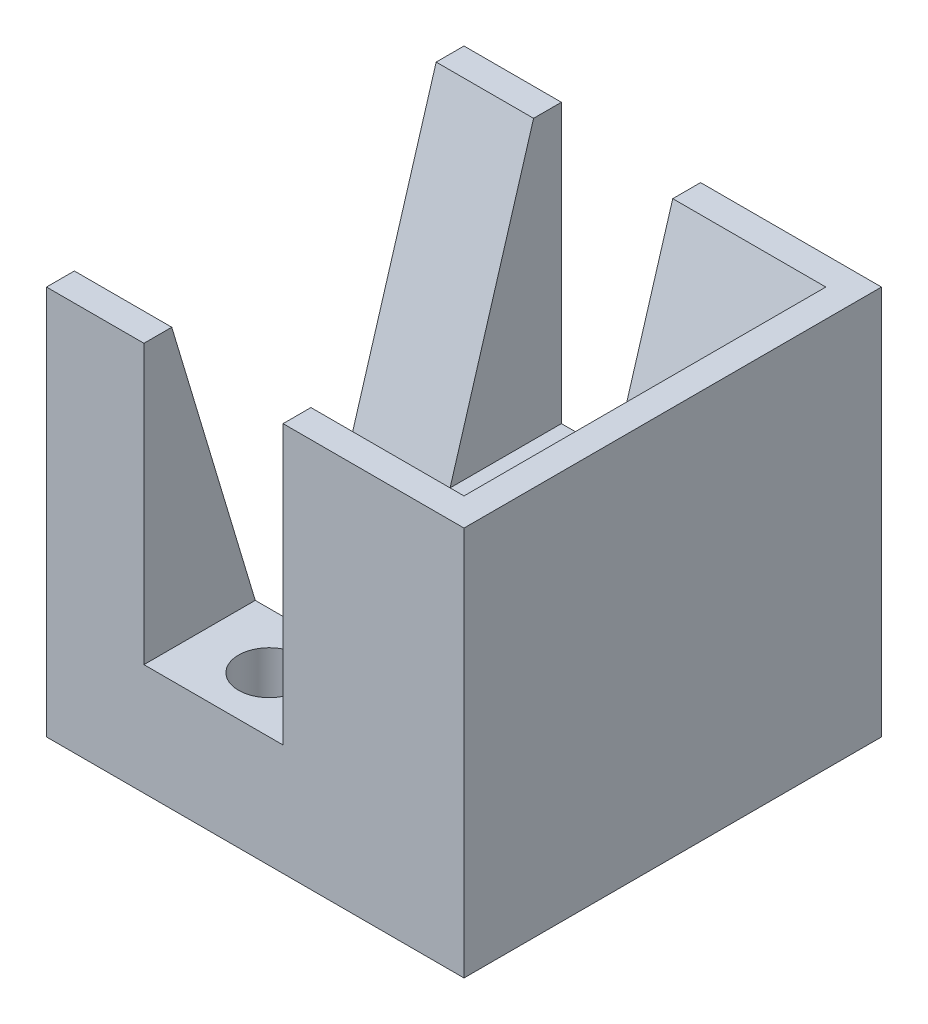
ISO-10303-21;
HEADER;
FILE_DESCRIPTION(('STEP AP214'),'2;1');
FILE_NAME('part.step','',(''),(''),'','','');
FILE_SCHEMA(('AUTOMOTIVE_DESIGN { 1 0 10303 214 1 1 1 1 }'));
ENDSEC;
DATA;
#1=APPLICATION_CONTEXT('core data for automotive mechanical design processes');
#2=APPLICATION_PROTOCOL_DEFINITION('international standard','automotive_design',2000,#1);
#3=PRODUCT_CONTEXT('',#1,'mechanical');
#4=PRODUCT('Part','Part','',(#3));
#5=PRODUCT_RELATED_PRODUCT_CATEGORY('part','',(#4));
#6=PRODUCT_DEFINITION_FORMATION('','',#4);
#7=PRODUCT_DEFINITION_CONTEXT('part definition',#1,'design');
#8=PRODUCT_DEFINITION('design','',#6,#7);
#9=PRODUCT_DEFINITION_SHAPE('','',#8);
#10=(LENGTH_UNIT() NAMED_UNIT(*) SI_UNIT(.MILLI.,.METRE.));
#11=(NAMED_UNIT(*) PLANE_ANGLE_UNIT() SI_UNIT($,.RADIAN.));
#12=(NAMED_UNIT(*) SI_UNIT($,.STERADIAN.) SOLID_ANGLE_UNIT());
#13=UNCERTAINTY_MEASURE_WITH_UNIT(LENGTH_MEASURE(1.E-05),#10,'distance_accuracy_value','');
#14=(GEOMETRIC_REPRESENTATION_CONTEXT(3) GLOBAL_UNCERTAINTY_ASSIGNED_CONTEXT((#13)) GLOBAL_UNIT_ASSIGNED_CONTEXT((#10,
#11,#12)) REPRESENTATION_CONTEXT('',''));
#15=CARTESIAN_POINT('',(0.,0.,0.));
#16=DIRECTION('',(0.,0.,1.));
#17=DIRECTION('',(1.,0.,0.));
#18=AXIS2_PLACEMENT_3D('',#15,#16,#17);
#19=CARTESIAN_POINT('',(-5.,4.,2.));
#20=DIRECTION('',(0.,0.,-1.));
#21=DIRECTION('',(-1.,0.,0.));
#22=AXIS2_PLACEMENT_3D('',#19,#20,#21);
#23=PLANE('',#22);
#24=DIRECTION('',(0.,-1.,0.));
#25=VECTOR('',#24,1.);
#26=CARTESIAN_POINT('',(5.,4.,2.));
#27=LINE('',#26,#25);
#28=CARTESIAN_POINT('',(5.,4.,2.));
#29=VERTEX_POINT('',#28);
#30=CARTESIAN_POINT('',(5.,0.,2.));
#31=VERTEX_POINT('',#30);
#32=EDGE_CURVE('E259',#29,#31,#27,.T.);
#33=ORIENTED_EDGE('',*,*,#32,.F.);
#34=DIRECTION('',(-1.,0.,0.));
#35=VECTOR('',#34,1.);
#36=CARTESIAN_POINT('',(15.4403065089106,4.,2.));
#37=LINE('',#36,#35);
#38=CARTESIAN_POINT('',(3.5,4.,2.));
#39=VERTEX_POINT('',#38);
#40=EDGE_CURVE('E298',#29,#39,#37,.T.);
#41=ORIENTED_EDGE('',*,*,#40,.T.);
#42=DIRECTION('',(1.,0.,0.));
#43=VECTOR('',#42,1.);
#44=CARTESIAN_POINT('',(-5.,4.,2.));
#45=LINE('',#44,#43);
#46=CARTESIAN_POINT('',(-1.5,4.,2.));
#47=VERTEX_POINT('',#46);
#48=EDGE_CURVE('E255',#47,#39,#45,.T.);
#49=ORIENTED_EDGE('',*,*,#48,.F.);
#50=CARTESIAN_POINT('',(-5.,4.,2.));
#51=VERTEX_POINT('',#50);
#52=EDGE_CURVE('E304',#47,#51,#37,.T.);
#53=ORIENTED_EDGE('',*,*,#52,.T.);
#54=DIRECTION('',(0.,-1.,0.));
#55=VECTOR('',#54,1.);
#56=CARTESIAN_POINT('',(-5.,4.,2.));
#57=LINE('',#56,#55);
#58=CARTESIAN_POINT('',(-5.,0.,2.));
#59=VERTEX_POINT('',#58);
#60=EDGE_CURVE('E176',#51,#59,#57,.T.);
#61=ORIENTED_EDGE('',*,*,#60,.T.);
#62=DIRECTION('',(1.,0.,0.));
#63=VECTOR('',#62,1.);
#64=CARTESIAN_POINT('',(-5.,0.,2.));
#65=LINE('',#64,#63);
#66=EDGE_CURVE('E256',#59,#31,#65,.T.);
#67=ORIENTED_EDGE('',*,*,#66,.T.);
#68=EDGE_LOOP('',(#33,#41,#49,#53,#61,#67));
#69=FACE_BOUND('',#68,.T.);
#70=ADVANCED_FACE('F34',(#69),#23,.F.);
#71=CARTESIAN_POINT('',(10.,-15.52417469626,9.));
#72=DIRECTION('',(0.,0.,-1.));
#73=DIRECTION('',(-1.,0.,0.));
#74=AXIS2_PLACEMENT_3D('',#71,#72,#73);
#75=PLANE('',#74);
#76=DIRECTION('',(-1.,0.,0.));
#77=VECTOR('',#76,1.);
#78=CARTESIAN_POINT('',(15.4403065089106,4.,9.));
#79=LINE('',#78,#77);
#80=CARTESIAN_POINT('',(5.,4.,9.));
#81=VERTEX_POINT('',#80);
#82=CARTESIAN_POINT('',(3.5,4.,9.));
#83=VERTEX_POINT('',#82);
#84=EDGE_CURVE('E277',#81,#83,#79,.T.);
#85=ORIENTED_EDGE('',*,*,#84,.F.);
#86=DIRECTION('',(0.,1.,0.));
#87=VECTOR('',#86,1.);
#88=CARTESIAN_POINT('',(5.,-12.0830459735946,9.));
#89=LINE('',#88,#87);
#90=CARTESIAN_POINT('',(5.,0.,9.));
#91=VERTEX_POINT('',#90);
#92=EDGE_CURVE('E242',#91,#81,#89,.T.);
#93=ORIENTED_EDGE('',*,*,#92,.F.);
#94=DIRECTION('',(1.,0.,0.));
#95=VECTOR('',#94,1.);
#96=CARTESIAN_POINT('',(10.,0.,9.));
#97=LINE('',#96,#95);
#98=CARTESIAN_POINT('',(-4.99999999999999,0.,9.));
#99=VERTEX_POINT('',#98);
#100=EDGE_CURVE('E227',#99,#91,#97,.T.);
#101=ORIENTED_EDGE('',*,*,#100,.F.);
#102=DIRECTION('',(0.,1.,0.));
#103=VECTOR('',#102,1.);
#104=CARTESIAN_POINT('',(-4.99999999999999,-15.52417469626,9.));
#105=LINE('',#104,#103);
#106=CARTESIAN_POINT('',(-5.,4.,9.));
#107=VERTEX_POINT('',#106);
#108=EDGE_CURVE('E232',#99,#107,#105,.T.);
#109=ORIENTED_EDGE('',*,*,#108,.T.);
#110=CARTESIAN_POINT('',(-1.49999999999999,4.,9.));
#111=VERTEX_POINT('',#110);
#112=EDGE_CURVE('E287',#111,#107,#79,.T.);
#113=ORIENTED_EDGE('',*,*,#112,.F.);
#114=DIRECTION('',(-1.,0.,0.));
#115=VECTOR('',#114,1.);
#116=CARTESIAN_POINT('',(10.,4.,9.));
#117=LINE('',#116,#115);
#118=EDGE_CURVE('E213',#83,#111,#117,.T.);
#119=ORIENTED_EDGE('',*,*,#118,.F.);
#120=EDGE_LOOP('',(#85,#93,#101,#109,#113,#119));
#121=FACE_BOUND('',#120,.T.);
#122=ADVANCED_FACE('F283',(#121),#75,.T.);
#123=CARTESIAN_POINT('',(0.,4.,0.));
#124=DIRECTION('',(0.,1.,0.));
#125=DIRECTION('',(0.,0.,1.));
#126=AXIS2_PLACEMENT_3D('',#123,#124,#125);
#127=PLANE('',#126);
#128=CARTESIAN_POINT('',(1.,4.,11.));
#129=DIRECTION('',(0.,1.,0.));
#130=DIRECTION('',(0.,0.,1.));
#131=AXIS2_PLACEMENT_3D('',#128,#129,#130);
#132=CIRCLE('',#131,1.1);
#133=CARTESIAN_POINT('',(1.,4.,12.1));
#134=VERTEX_POINT('',#133);
#135=EDGE_CURVE('E214',#134,#134,#132,.T.);
#136=ORIENTED_EDGE('',*,*,#135,.F.);
#137=EDGE_LOOP('',(#136));
#138=FACE_BOUND('',#137,.T.);
#139=DIRECTION('',(1.,0.,0.));
#140=VECTOR('',#139,1.);
#141=CARTESIAN_POINT('',(10.,4.,13.));
#142=LINE('',#141,#140);
#143=CARTESIAN_POINT('',(-1.49999999999999,4.,13.));
#144=VERTEX_POINT('',#143);
#145=CARTESIAN_POINT('',(3.5,4.,13.));
#146=VERTEX_POINT('',#145);
#147=EDGE_CURVE('E230',#144,#146,#142,.T.);
#148=ORIENTED_EDGE('',*,*,#147,.T.);
#149=DIRECTION('',(0.,0.,1.));
#150=VECTOR('',#149,1.);
#151=CARTESIAN_POINT('',(3.5,4.,13.));
#152=LINE('',#151,#150);
#153=EDGE_CURVE('E327',#83,#146,#152,.T.);
#154=ORIENTED_EDGE('',*,*,#153,.F.);
#155=ORIENTED_EDGE('',*,*,#118,.T.);
#156=DIRECTION('',(0.,0.,-1.));
#157=VECTOR('',#156,1.);
#158=CARTESIAN_POINT('',(-1.49999999999999,4.,13.));
#159=LINE('',#158,#157);
#160=EDGE_CURVE('E196',#144,#111,#159,.T.);
#161=ORIENTED_EDGE('',*,*,#160,.F.);
#162=EDGE_LOOP('',(#148,#154,#155,#161));
#163=FACE_BOUND('',#162,.T.);
#164=ADVANCED_FACE('F377',(#138,#163),#127,.T.);
#165=CARTESIAN_POINT('',(1.,4.,0.));
#166=DIRECTION('',(0.,1.,0.));
#167=DIRECTION('',(0.,0.,1.));
#168=AXIS2_PLACEMENT_3D('',#165,#166,#167);
#169=CIRCLE('',#168,1.1);
#170=CARTESIAN_POINT('',(1.,4.,1.1));
#171=VERTEX_POINT('',#170);
#172=EDGE_CURVE('E209',#171,#171,#169,.T.);
#173=ORIENTED_EDGE('',*,*,#172,.F.);
#174=EDGE_LOOP('',(#173));
#175=FACE_BOUND('',#174,.T.);
#176=ORIENTED_EDGE('',*,*,#48,.T.);
#177=DIRECTION('',(0.,0.,1.));
#178=VECTOR('',#177,1.);
#179=CARTESIAN_POINT('',(3.5,4.,-2.));
#180=LINE('',#179,#178);
#181=CARTESIAN_POINT('',(3.5,4.,-2.));
#182=VERTEX_POINT('',#181);
#183=EDGE_CURVE('E338',#182,#39,#180,.T.);
#184=ORIENTED_EDGE('',*,*,#183,.F.);
#185=DIRECTION('',(-1.,0.,0.));
#186=VECTOR('',#185,1.);
#187=CARTESIAN_POINT('',(-5.,4.,-2.));
#188=LINE('',#187,#186);
#189=CARTESIAN_POINT('',(-1.5,4.,-2.));
#190=VERTEX_POINT('',#189);
#191=EDGE_CURVE('E253',#182,#190,#188,.T.);
#192=ORIENTED_EDGE('',*,*,#191,.T.);
#193=DIRECTION('',(0.,0.,-1.));
#194=VECTOR('',#193,1.);
#195=CARTESIAN_POINT('',(-1.5,4.,2.));
#196=LINE('',#195,#194);
#197=EDGE_CURVE('E183',#47,#190,#196,.T.);
#198=ORIENTED_EDGE('',*,*,#197,.F.);
#199=EDGE_LOOP('',(#176,#184,#192,#198));
#200=FACE_BOUND('',#199,.T.);
#201=ADVANCED_FACE('F353',(#175,#200),#127,.T.);
#202=CARTESIAN_POINT('',(-5.,4.,-2.));
#203=DIRECTION('',(0.,0.,1.));
#204=DIRECTION('',(1.,0.,0.));
#205=AXIS2_PLACEMENT_3D('',#202,#203,#204);
#206=PLANE('',#205);
#207=DIRECTION('',(-1.,0.,0.));
#208=VECTOR('',#207,1.);
#209=CARTESIAN_POINT('',(-5.,0.,-2.));
#210=LINE('',#209,#208);
#211=CARTESIAN_POINT('',(10.,0.,-2.));
#212=VERTEX_POINT('',#211);
#213=CARTESIAN_POINT('',(-5.,0.,-2.));
#214=VERTEX_POINT('',#213);
#215=EDGE_CURVE('E249',#212,#214,#210,.T.);
#216=ORIENTED_EDGE('',*,*,#215,.T.);
#217=DIRECTION('',(0.,-1.,0.));
#218=VECTOR('',#217,1.);
#219=CARTESIAN_POINT('',(-5.,4.,-2.));
#220=LINE('',#219,#218);
#221=CARTESIAN_POINT('',(-5.,14.,-2.));
#222=VERTEX_POINT('',#221);
#223=EDGE_CURVE('E267',#222,#214,#220,.T.);
#224=ORIENTED_EDGE('',*,*,#223,.F.);
#225=DIRECTION('',(-1.,0.,0.));
#226=VECTOR('',#225,1.);
#227=CARTESIAN_POINT('',(-5.,14.,-2.));
#228=LINE('',#227,#226);
#229=CARTESIAN_POINT('',(-1.5,14.,-2.));
#230=VERTEX_POINT('',#229);
#231=EDGE_CURVE('E181',#230,#222,#228,.T.);
#232=ORIENTED_EDGE('',*,*,#231,.F.);
#233=DIRECTION('',(0.,-1.,0.));
#234=VECTOR('',#233,1.);
#235=CARTESIAN_POINT('',(-1.5,14.,-2.));
#236=LINE('',#235,#234);
#237=EDGE_CURVE('E192',#230,#190,#236,.T.);
#238=ORIENTED_EDGE('',*,*,#237,.T.);
#239=ORIENTED_EDGE('',*,*,#191,.F.);
#240=DIRECTION('',(0.,-1.,0.));
#241=VECTOR('',#240,1.);
#242=CARTESIAN_POINT('',(3.5,14.,-2.));
#243=LINE('',#242,#241);
#244=CARTESIAN_POINT('',(3.5,14.,-2.));
#245=VERTEX_POINT('',#244);
#246=EDGE_CURVE('E187',#245,#182,#243,.T.);
#247=ORIENTED_EDGE('',*,*,#246,.F.);
#248=DIRECTION('',(-1.,0.,0.));
#249=VECTOR('',#248,1.);
#250=CARTESIAN_POINT('',(3.5,14.,-2.));
#251=LINE('',#250,#249);
#252=CARTESIAN_POINT('',(10.,14.,-2.));
#253=VERTEX_POINT('',#252);
#254=EDGE_CURVE('E344',#253,#245,#251,.T.);
#255=ORIENTED_EDGE('',*,*,#254,.F.);
#256=DIRECTION('',(0.,1.,0.));
#257=VECTOR('',#256,1.);
#258=CARTESIAN_POINT('',(10.,-12.0830459735946,-2.));
#259=LINE('',#258,#257);
#260=EDGE_CURVE('E246',#212,#253,#259,.T.);
#261=ORIENTED_EDGE('',*,*,#260,.F.);
#262=EDGE_LOOP('',(#216,#224,#232,#238,#239,#247,#255,#261));
#263=FACE_BOUND('',#262,.T.);
#264=ADVANCED_FACE('F356',(#263),#206,.F.);
#265=CARTESIAN_POINT('',(-5.,4.,-2.));
#266=DIRECTION('',(1.,0.,0.));
#267=DIRECTION('',(0.,0.,-1.));
#268=AXIS2_PLACEMENT_3D('',#265,#266,#267);
#269=PLANE('',#268);
#270=ORIENTED_EDGE('',*,*,#60,.F.);
#271=DIRECTION('',(0.,-0.957826285221151,0.287347885566345));
#272=VECTOR('',#271,1.);
#273=CARTESIAN_POINT('',(-5.,4.,2.));
#274=LINE('',#273,#272);
#275=CARTESIAN_POINT('',(-5.,14.,-0.999999999999998));
#276=VERTEX_POINT('',#275);
#277=EDGE_CURVE('E161',#276,#51,#274,.T.);
#278=ORIENTED_EDGE('',*,*,#277,.F.);
#279=DIRECTION('',(0.,0.,1.));
#280=VECTOR('',#279,1.);
#281=CARTESIAN_POINT('',(-5.,14.,2.));
#282=LINE('',#281,#280);
#283=EDGE_CURVE('E174',#222,#276,#282,.T.);
#284=ORIENTED_EDGE('',*,*,#283,.F.);
#285=ORIENTED_EDGE('',*,*,#223,.T.);
#286=DIRECTION('',(0.,0.,1.));
#287=VECTOR('',#286,1.);
#288=CARTESIAN_POINT('',(-5.,0.,-2.));
#289=LINE('',#288,#287);
#290=EDGE_CURVE('E261',#214,#59,#289,.T.);
#291=ORIENTED_EDGE('',*,*,#290,.T.);
#292=EDGE_LOOP('',(#270,#278,#284,#285,#291));
#293=FACE_BOUND('',#292,.T.);
#294=ADVANCED_FACE('F172',(#293),#269,.F.);
#295=CARTESIAN_POINT('',(0.,0.,0.));
#296=DIRECTION('',(0.,1.,0.));
#297=DIRECTION('',(0.,0.,1.));
#298=AXIS2_PLACEMENT_3D('',#295,#296,#297);
#299=PLANE('',#298);
#300=CARTESIAN_POINT('',(1.,0.,11.));
#301=DIRECTION('',(0.,1.,0.));
#302=DIRECTION('',(0.,0.,1.));
#303=AXIS2_PLACEMENT_3D('',#300,#301,#302);
#304=CIRCLE('',#303,1.1);
#305=CARTESIAN_POINT('',(1.,0.,12.1));
#306=VERTEX_POINT('',#305);
#307=EDGE_CURVE('E210',#306,#306,#304,.T.);
#308=ORIENTED_EDGE('',*,*,#307,.T.);
#309=EDGE_LOOP('',(#308));
#310=FACE_BOUND('',#309,.T.);
#311=CARTESIAN_POINT('',(1.,0.,0.));
#312=DIRECTION('',(0.,1.,0.));
#313=DIRECTION('',(0.,0.,1.));
#314=AXIS2_PLACEMENT_3D('',#311,#312,#313);
#315=CIRCLE('',#314,1.1);
#316=CARTESIAN_POINT('',(1.,0.,1.1));
#317=VERTEX_POINT('',#316);
#318=EDGE_CURVE('E217',#317,#317,#315,.T.);
#319=ORIENTED_EDGE('',*,*,#318,.T.);
#320=EDGE_LOOP('',(#319));
#321=FACE_BOUND('',#320,.T.);
#322=ORIENTED_EDGE('',*,*,#215,.F.);
#323=DIRECTION('',(0.,0.,1.));
#324=VECTOR('',#323,1.);
#325=CARTESIAN_POINT('',(10.,0.,-2.));
#326=LINE('',#325,#324);
#327=CARTESIAN_POINT('',(10.,0.,13.));
#328=VERTEX_POINT('',#327);
#329=EDGE_CURVE('E243',#212,#328,#326,.T.);
#330=ORIENTED_EDGE('',*,*,#329,.T.);
#331=DIRECTION('',(-1.,0.,0.));
#332=VECTOR('',#331,1.);
#333=CARTESIAN_POINT('',(10.,0.,13.));
#334=LINE('',#333,#332);
#335=CARTESIAN_POINT('',(-4.99999999999999,0.,13.));
#336=VERTEX_POINT('',#335);
#337=EDGE_CURVE('E224',#328,#336,#334,.T.);
#338=ORIENTED_EDGE('',*,*,#337,.T.);
#339=DIRECTION('',(0.,0.,-1.));
#340=VECTOR('',#339,1.);
#341=CARTESIAN_POINT('',(-4.99999999999999,0.,9.));
#342=LINE('',#341,#340);
#343=EDGE_CURVE('E222',#336,#99,#342,.T.);
#344=ORIENTED_EDGE('',*,*,#343,.T.);
#345=ORIENTED_EDGE('',*,*,#100,.T.);
#346=DIRECTION('',(0.,0.,-1.));
#347=VECTOR('',#346,1.);
#348=CARTESIAN_POINT('',(5.,0.,-2.));
#349=LINE('',#348,#347);
#350=EDGE_CURVE('E245',#91,#31,#349,.T.);
#351=ORIENTED_EDGE('',*,*,#350,.T.);
#352=ORIENTED_EDGE('',*,*,#66,.F.);
#353=ORIENTED_EDGE('',*,*,#290,.F.);
#354=EDGE_LOOP('',(#322,#330,#338,#344,#345,#351,#352,#353));
#355=FACE_BOUND('',#354,.T.);
#356=ADVANCED_FACE('F309',(#310,#321,#355),#299,.F.);
#357=CARTESIAN_POINT('',(5.,-12.0830459735946,-2.));
#358=DIRECTION('',(-1.,0.,0.));
#359=DIRECTION('',(0.,0.,1.));
#360=AXIS2_PLACEMENT_3D('',#357,#358,#359);
#361=PLANE('',#360);
#362=ORIENTED_EDGE('',*,*,#92,.T.);
#363=DIRECTION('',(0.,0.,-1.));
#364=VECTOR('',#363,1.);
#365=CARTESIAN_POINT('',(5.,3.9999999999999,-2.));
#366=LINE('',#365,#364);
#367=EDGE_CURVE('E274',#81,#29,#366,.T.);
#368=ORIENTED_EDGE('',*,*,#367,.T.);
#369=ORIENTED_EDGE('',*,*,#32,.T.);
#370=ORIENTED_EDGE('',*,*,#350,.F.);
#371=EDGE_LOOP('',(#362,#368,#369,#370));
#372=FACE_BOUND('',#371,.T.);
#373=ADVANCED_FACE('F291',(#372),#361,.T.);
#374=CARTESIAN_POINT('',(10.,-12.0830459735946,-2.));
#375=DIRECTION('',(1.,0.,0.));
#376=DIRECTION('',(0.,0.,-1.));
#377=AXIS2_PLACEMENT_3D('',#374,#375,#376);
#378=PLANE('',#377);
#379=DIRECTION('',(0.,0.,-1.));
#380=VECTOR('',#379,1.);
#381=CARTESIAN_POINT('',(10.,14.,-2.));
#382=LINE('',#381,#380);
#383=CARTESIAN_POINT('',(10.,14.,13.));
#384=VERTEX_POINT('',#383);
#385=EDGE_CURVE('E341',#384,#253,#382,.T.);
#386=ORIENTED_EDGE('',*,*,#385,.F.);
#387=DIRECTION('',(0.,1.,0.));
#388=VECTOR('',#387,1.);
#389=CARTESIAN_POINT('',(10.,-15.52417469626,13.));
#390=LINE('',#389,#388);
#391=EDGE_CURVE('E225',#328,#384,#390,.T.);
#392=ORIENTED_EDGE('',*,*,#391,.F.);
#393=ORIENTED_EDGE('',*,*,#329,.F.);
#394=ORIENTED_EDGE('',*,*,#260,.T.);
#395=EDGE_LOOP('',(#386,#392,#393,#394));
#396=FACE_BOUND('',#395,.T.);
#397=ADVANCED_FACE('F396',(#396),#378,.T.);
#398=CARTESIAN_POINT('',(10.,-15.52417469626,13.));
#399=DIRECTION('',(0.,0.,1.));
#400=DIRECTION('',(1.,0.,0.));
#401=AXIS2_PLACEMENT_3D('',#398,#399,#400);
#402=PLANE('',#401);
#403=ORIENTED_EDGE('',*,*,#337,.F.);
#404=ORIENTED_EDGE('',*,*,#391,.T.);
#405=DIRECTION('',(1.,0.,0.));
#406=VECTOR('',#405,1.);
#407=CARTESIAN_POINT('',(3.5,14.,13.));
#408=LINE('',#407,#406);
#409=CARTESIAN_POINT('',(3.5,14.,13.));
#410=VERTEX_POINT('',#409);
#411=EDGE_CURVE('E330',#410,#384,#408,.T.);
#412=ORIENTED_EDGE('',*,*,#411,.F.);
#413=DIRECTION('',(0.,-1.,0.));
#414=VECTOR('',#413,1.);
#415=CARTESIAN_POINT('',(3.5,14.,13.));
#416=LINE('',#415,#414);
#417=EDGE_CURVE('E333',#410,#146,#416,.T.);
#418=ORIENTED_EDGE('',*,*,#417,.T.);
#419=ORIENTED_EDGE('',*,*,#147,.F.);
#420=DIRECTION('',(0.,-1.,0.));
#421=VECTOR('',#420,1.);
#422=CARTESIAN_POINT('',(-1.49999999999999,14.,13.));
#423=LINE('',#422,#421);
#424=CARTESIAN_POINT('',(-1.49999999999999,14.,13.));
#425=VERTEX_POINT('',#424);
#426=EDGE_CURVE('E204',#425,#144,#423,.T.);
#427=ORIENTED_EDGE('',*,*,#426,.F.);
#428=DIRECTION('',(1.,0.,0.));
#429=VECTOR('',#428,1.);
#430=CARTESIAN_POINT('',(-4.99999999999999,14.,13.));
#431=LINE('',#430,#429);
#432=CARTESIAN_POINT('',(-4.99999999999999,14.,13.));
#433=VERTEX_POINT('',#432);
#434=EDGE_CURVE('E199',#433,#425,#431,.T.);
#435=ORIENTED_EDGE('',*,*,#434,.F.);
#436=DIRECTION('',(0.,1.,0.));
#437=VECTOR('',#436,1.);
#438=CARTESIAN_POINT('',(-4.99999999999999,-15.52417469626,13.));
#439=LINE('',#438,#437);
#440=EDGE_CURVE('E235',#336,#433,#439,.T.);
#441=ORIENTED_EDGE('',*,*,#440,.F.);
#442=EDGE_LOOP('',(#403,#404,#412,#418,#419,#427,#435,#441));
#443=FACE_BOUND('',#442,.T.);
#444=ADVANCED_FACE('F398',(#443),#402,.T.);
#445=CARTESIAN_POINT('',(-4.99999999999999,-15.52417469626,9.));
#446=DIRECTION('',(-1.,0.,0.));
#447=DIRECTION('',(0.,0.,1.));
#448=AXIS2_PLACEMENT_3D('',#445,#446,#447);
#449=PLANE('',#448);
#450=DIRECTION('',(0.,0.957826285221151,0.287347885566345));
#451=VECTOR('',#450,1.);
#452=CARTESIAN_POINT('',(-5.,14.,12.));
#453=LINE('',#452,#451);
#454=CARTESIAN_POINT('',(-4.99999999999999,14.,12.));
#455=VERTEX_POINT('',#454);
#456=EDGE_CURVE('E317',#107,#455,#453,.T.);
#457=ORIENTED_EDGE('',*,*,#456,.F.);
#458=ORIENTED_EDGE('',*,*,#108,.F.);
#459=ORIENTED_EDGE('',*,*,#343,.F.);
#460=ORIENTED_EDGE('',*,*,#440,.T.);
#461=DIRECTION('',(0.,0.,1.));
#462=VECTOR('',#461,1.);
#463=CARTESIAN_POINT('',(-4.99999999999999,14.,13.));
#464=LINE('',#463,#462);
#465=EDGE_CURVE('E197',#455,#433,#464,.T.);
#466=ORIENTED_EDGE('',*,*,#465,.F.);
#467=EDGE_LOOP('',(#457,#458,#459,#460,#466));
#468=FACE_BOUND('',#467,.T.);
#469=ADVANCED_FACE('F314',(#468),#449,.T.);
#470=CARTESIAN_POINT('',(1.,0.,0.));
#471=DIRECTION('',(0.,1.,0.));
#472=DIRECTION('',(0.,0.,1.));
#473=AXIS2_PLACEMENT_3D('',#470,#471,#472);
#474=CYLINDRICAL_SURFACE('',#473,1.1);
#475=ORIENTED_EDGE('',*,*,#318,.F.);
#476=EDGE_LOOP('',(#475));
#477=FACE_BOUND('',#476,.T.);
#478=ORIENTED_EDGE('',*,*,#172,.T.);
#479=EDGE_LOOP('',(#478));
#480=FACE_BOUND('',#479,.T.);
#481=ADVANCED_FACE('F403',(#477,#480),#474,.F.);
#482=CARTESIAN_POINT('',(1.,0.,11.));
#483=DIRECTION('',(0.,1.,0.));
#484=DIRECTION('',(0.,0.,1.));
#485=AXIS2_PLACEMENT_3D('',#482,#483,#484);
#486=CYLINDRICAL_SURFACE('',#485,1.1);
#487=ORIENTED_EDGE('',*,*,#307,.F.);
#488=EDGE_LOOP('',(#487));
#489=FACE_BOUND('',#488,.T.);
#490=ORIENTED_EDGE('',*,*,#135,.T.);
#491=EDGE_LOOP('',(#490));
#492=FACE_BOUND('',#491,.T.);
#493=ADVANCED_FACE('F409',(#489,#492),#486,.F.);
#494=CARTESIAN_POINT('',(-1.49999999999999,14.,13.));
#495=DIRECTION('',(-1.,0.,0.));
#496=DIRECTION('',(0.,0.,1.));
#497=AXIS2_PLACEMENT_3D('',#494,#495,#496);
#498=PLANE('',#497);
#499=ORIENTED_EDGE('',*,*,#160,.T.);
#500=DIRECTION('',(0.,0.957826285221151,0.287347885566345));
#501=VECTOR('',#500,1.);
#502=CARTESIAN_POINT('',(-1.49999999999999,14.2752293577982,12.0825688073395));
#503=LINE('',#502,#501);
#504=CARTESIAN_POINT('',(-1.49999999999999,14.,12.));
#505=VERTEX_POINT('',#504);
#506=EDGE_CURVE('E303',#111,#505,#503,.T.);
#507=ORIENTED_EDGE('',*,*,#506,.T.);
#508=DIRECTION('',(0.,0.,-1.));
#509=VECTOR('',#508,1.);
#510=CARTESIAN_POINT('',(-1.49999999999999,14.,13.));
#511=LINE('',#510,#509);
#512=EDGE_CURVE('E201',#425,#505,#511,.T.);
#513=ORIENTED_EDGE('',*,*,#512,.F.);
#514=ORIENTED_EDGE('',*,*,#426,.T.);
#515=EDGE_LOOP('',(#499,#507,#513,#514));
#516=FACE_BOUND('',#515,.T.);
#517=ADVANCED_FACE('F369',(#516),#498,.F.);
#518=CARTESIAN_POINT('',(0.,14.,0.));
#519=DIRECTION('',(0.,-1.,0.));
#520=DIRECTION('',(0.,0.,-1.));
#521=AXIS2_PLACEMENT_3D('',#518,#519,#520);
#522=PLANE('',#521);
#523=ORIENTED_EDGE('',*,*,#512,.T.);
#524=DIRECTION('',(-1.,0.,0.));
#525=VECTOR('',#524,1.);
#526=CARTESIAN_POINT('',(15.4403065089106,14.,12.));
#527=LINE('',#526,#525);
#528=EDGE_CURVE('E286',#505,#455,#527,.T.);
#529=ORIENTED_EDGE('',*,*,#528,.T.);
#530=ORIENTED_EDGE('',*,*,#465,.T.);
#531=ORIENTED_EDGE('',*,*,#434,.T.);
#532=EDGE_LOOP('',(#523,#529,#530,#531));
#533=FACE_BOUND('',#532,.T.);
#534=ADVANCED_FACE('F362',(#533),#522,.F.);
#535=CARTESIAN_POINT('',(-1.5,14.,2.));
#536=DIRECTION('',(-1.,0.,0.));
#537=DIRECTION('',(0.,0.,1.));
#538=AXIS2_PLACEMENT_3D('',#535,#536,#537);
#539=PLANE('',#538);
#540=DIRECTION('',(0.,0.,-1.));
#541=VECTOR('',#540,1.);
#542=CARTESIAN_POINT('',(-1.5,14.,2.));
#543=LINE('',#542,#541);
#544=CARTESIAN_POINT('',(-1.5,14.,-0.999999999999999));
#545=VERTEX_POINT('',#544);
#546=EDGE_CURVE('E182',#545,#230,#543,.T.);
#547=ORIENTED_EDGE('',*,*,#546,.F.);
#548=DIRECTION('',(0.,-0.957826285221152,0.287347885566345));
#549=VECTOR('',#548,1.);
#550=CARTESIAN_POINT('',(-1.5,13.1743119266055,-0.752293577981652));
#551=LINE('',#550,#549);
#552=EDGE_CURVE('E164',#545,#47,#551,.T.);
#553=ORIENTED_EDGE('',*,*,#552,.T.);
#554=ORIENTED_EDGE('',*,*,#197,.T.);
#555=ORIENTED_EDGE('',*,*,#237,.F.);
#556=EDGE_LOOP('',(#547,#553,#554,#555));
#557=FACE_BOUND('',#556,.T.);
#558=ADVANCED_FACE('F360',(#557),#539,.F.);
#559=CARTESIAN_POINT('',(0.,14.,0.));
#560=DIRECTION('',(0.,-1.,0.));
#561=DIRECTION('',(0.,0.,-1.));
#562=AXIS2_PLACEMENT_3D('',#559,#560,#561);
#563=PLANE('',#562);
#564=ORIENTED_EDGE('',*,*,#283,.T.);
#565=DIRECTION('',(-1.,0.,0.));
#566=VECTOR('',#565,1.);
#567=CARTESIAN_POINT('',(15.4403065089106,14.,-1.));
#568=LINE('',#567,#566);
#569=EDGE_CURVE('E158',#545,#276,#568,.T.);
#570=ORIENTED_EDGE('',*,*,#569,.F.);
#571=ORIENTED_EDGE('',*,*,#546,.T.);
#572=ORIENTED_EDGE('',*,*,#231,.T.);
#573=EDGE_LOOP('',(#564,#570,#571,#572));
#574=FACE_BOUND('',#573,.T.);
#575=ADVANCED_FACE('F179',(#574),#563,.F.);
#576=CARTESIAN_POINT('',(3.5,14.,-2.));
#577=DIRECTION('',(1.,0.,0.));
#578=DIRECTION('',(0.,0.,-1.));
#579=AXIS2_PLACEMENT_3D('',#576,#577,#578);
#580=PLANE('',#579);
#581=ORIENTED_EDGE('',*,*,#183,.T.);
#582=DIRECTION('',(0.,0.957826285221152,-0.287347885566345));
#583=VECTOR('',#582,1.);
#584=CARTESIAN_POINT('',(3.5,14.2752293577982,-1.08256880733945));
#585=LINE('',#584,#583);
#586=CARTESIAN_POINT('',(3.5,14.,-1.));
#587=VERTEX_POINT('',#586);
#588=EDGE_CURVE('E300',#39,#587,#585,.T.);
#589=ORIENTED_EDGE('',*,*,#588,.T.);
#590=DIRECTION('',(0.,0.,1.));
#591=VECTOR('',#590,1.);
#592=CARTESIAN_POINT('',(3.5,14.,-2.));
#593=LINE('',#592,#591);
#594=EDGE_CURVE('E339',#245,#587,#593,.T.);
#595=ORIENTED_EDGE('',*,*,#594,.F.);
#596=ORIENTED_EDGE('',*,*,#246,.T.);
#597=EDGE_LOOP('',(#581,#589,#595,#596));
#598=FACE_BOUND('',#597,.T.);
#599=ADVANCED_FACE('F348',(#598),#580,.F.);
#600=CARTESIAN_POINT('',(0.,14.,0.));
#601=DIRECTION('',(0.,1.,0.));
#602=DIRECTION('',(0.,0.,1.));
#603=AXIS2_PLACEMENT_3D('',#600,#601,#602);
#604=PLANE('',#603);
#605=DIRECTION('',(0.,0.,1.));
#606=VECTOR('',#605,1.);
#607=CARTESIAN_POINT('',(9.00000000000001,14.,0.));
#608=LINE('',#607,#606);
#609=CARTESIAN_POINT('',(9.00000000000001,14.,-1.));
#610=VERTEX_POINT('',#609);
#611=CARTESIAN_POINT('',(9.00000000000001,14.,12.));
#612=VERTEX_POINT('',#611);
#613=EDGE_CURVE('E272',#610,#612,#608,.T.);
#614=ORIENTED_EDGE('',*,*,#613,.T.);
#615=CARTESIAN_POINT('',(3.5,14.,12.));
#616=VERTEX_POINT('',#615);
#617=EDGE_CURVE('E49',#612,#616,#527,.T.);
#618=ORIENTED_EDGE('',*,*,#617,.T.);
#619=DIRECTION('',(0.,0.,1.));
#620=VECTOR('',#619,1.);
#621=CARTESIAN_POINT('',(3.5,14.,13.));
#622=LINE('',#621,#620);
#623=EDGE_CURVE('E328',#616,#410,#622,.T.);
#624=ORIENTED_EDGE('',*,*,#623,.T.);
#625=ORIENTED_EDGE('',*,*,#411,.T.);
#626=ORIENTED_EDGE('',*,*,#385,.T.);
#627=ORIENTED_EDGE('',*,*,#254,.T.);
#628=ORIENTED_EDGE('',*,*,#594,.T.);
#629=EDGE_CURVE('E57',#610,#587,#568,.T.);
#630=ORIENTED_EDGE('',*,*,#629,.F.);
#631=EDGE_LOOP('',(#614,#618,#624,#625,#626,#627,#628,#630));
#632=FACE_BOUND('',#631,.T.);
#633=ADVANCED_FACE('F430',(#632),#604,.T.);
#634=CARTESIAN_POINT('',(3.5,14.,13.));
#635=DIRECTION('',(1.,0.,0.));
#636=DIRECTION('',(0.,0.,-1.));
#637=AXIS2_PLACEMENT_3D('',#634,#635,#636);
#638=PLANE('',#637);
#639=ORIENTED_EDGE('',*,*,#623,.F.);
#640=DIRECTION('',(0.,-0.957826285221151,-0.287347885566345));
#641=VECTOR('',#640,1.);
#642=CARTESIAN_POINT('',(3.5,14.2752293577982,12.0825688073394));
#643=LINE('',#642,#641);
#644=EDGE_CURVE('E269',#616,#83,#643,.T.);
#645=ORIENTED_EDGE('',*,*,#644,.T.);
#646=ORIENTED_EDGE('',*,*,#153,.T.);
#647=ORIENTED_EDGE('',*,*,#417,.F.);
#648=EDGE_LOOP('',(#639,#645,#646,#647));
#649=FACE_BOUND('',#648,.T.);
#650=ADVANCED_FACE('F429',(#649),#638,.F.);
#651=CARTESIAN_POINT('',(15.4403065089106,14.,12.));
#652=DIRECTION('',(0.,-0.287347885566345,0.957826285221151));
#653=DIRECTION('',(0.,-0.957826285221151,-0.287347885566345));
#654=AXIS2_PLACEMENT_3D('',#651,#652,#653);
#655=PLANE('',#654);
#656=ORIENTED_EDGE('',*,*,#617,.F.);
#657=DIRECTION('',(0.357770876399964,0.894427190999917,0.268328157299975));
#658=VECTOR('',#657,1.);
#659=CARTESIAN_POINT('',(9.82435923314055,16.0608980828514,12.6182694248554));
#660=LINE('',#659,#658);
#661=EDGE_CURVE('E42',#612,#81,#660,.F.);
#662=ORIENTED_EDGE('',*,*,#661,.T.);
#663=ORIENTED_EDGE('',*,*,#84,.T.);
#664=ORIENTED_EDGE('',*,*,#644,.F.);
#665=EDGE_LOOP('',(#656,#662,#663,#664));
#666=FACE_BOUND('',#665,.T.);
#667=ADVANCED_FACE('F276',(#666),#655,.F.);
#668=CARTESIAN_POINT('',(15.4403065089106,4.,2.));
#669=DIRECTION('',(0.,-0.287347885566345,-0.957826285221151));
#670=DIRECTION('',(0.,0.957826285221152,-0.287347885566345));
#671=AXIS2_PLACEMENT_3D('',#668,#669,#670);
#672=PLANE('',#671);
#673=ORIENTED_EDGE('',*,*,#40,.F.);
#674=DIRECTION('',(-0.357770876399964,-0.894427190999917,0.268328157299975));
#675=VECTOR('',#674,1.);
#676=CARTESIAN_POINT('',(6.33635923314057,7.34089808285135,0.997730575144596));
#677=LINE('',#676,#675);
#678=EDGE_CURVE('E11',#29,#610,#677,.F.);
#679=ORIENTED_EDGE('',*,*,#678,.T.);
#680=ORIENTED_EDGE('',*,*,#629,.T.);
#681=ORIENTED_EDGE('',*,*,#588,.F.);
#682=EDGE_LOOP('',(#673,#679,#680,#681));
#683=FACE_BOUND('',#682,.T.);
#684=ADVANCED_FACE('F295',(#683),#672,.F.);
#685=ORIENTED_EDGE('',*,*,#569,.T.);
#686=ORIENTED_EDGE('',*,*,#277,.T.);
#687=ORIENTED_EDGE('',*,*,#52,.F.);
#688=ORIENTED_EDGE('',*,*,#552,.F.);
#689=EDGE_LOOP('',(#685,#686,#687,#688));
#690=FACE_BOUND('',#689,.T.);
#691=ADVANCED_FACE('F160',(#690),#672,.F.);
#692=ORIENTED_EDGE('',*,*,#112,.T.);
#693=ORIENTED_EDGE('',*,*,#456,.T.);
#694=ORIENTED_EDGE('',*,*,#528,.F.);
#695=ORIENTED_EDGE('',*,*,#506,.F.);
#696=EDGE_LOOP('',(#692,#693,#694,#695));
#697=FACE_BOUND('',#696,.T.);
#698=ADVANCED_FACE('F434',(#697),#655,.F.);
#699=CARTESIAN_POINT('',(9.00000000000001,14.,0.));
#700=DIRECTION('',(0.92847669088526,-0.371390676354101,0.));
#701=DIRECTION('',(0.,0.,1.));
#702=AXIS2_PLACEMENT_3D('',#699,#700,#701);
#703=PLANE('',#702);
#704=ORIENTED_EDGE('',*,*,#678,.F.);
#705=ORIENTED_EDGE('',*,*,#367,.F.);
#706=ORIENTED_EDGE('',*,*,#661,.F.);
#707=ORIENTED_EDGE('',*,*,#613,.F.);
#708=EDGE_LOOP('',(#704,#705,#706,#707));
#709=FACE_BOUND('',#708,.T.);
#710=ADVANCED_FACE('F36',(#709),#703,.F.);
#711=CLOSED_SHELL('',(#70,#122,#164,#201,#264,#294,#356,#373,#397,#444,#469,#481,#493,#517,#534,
#558,#575,#599,#633,#650,#667,#684,#691,#698,#710));
#712=MANIFOLD_SOLID_BREP('B2',#711);
#713=ADVANCED_BREP_SHAPE_REPRESENTATION('',(#18,#712),#14);
#714=SHAPE_DEFINITION_REPRESENTATION(#9,#713);
ENDSEC;
END-ISO-10303-21;
